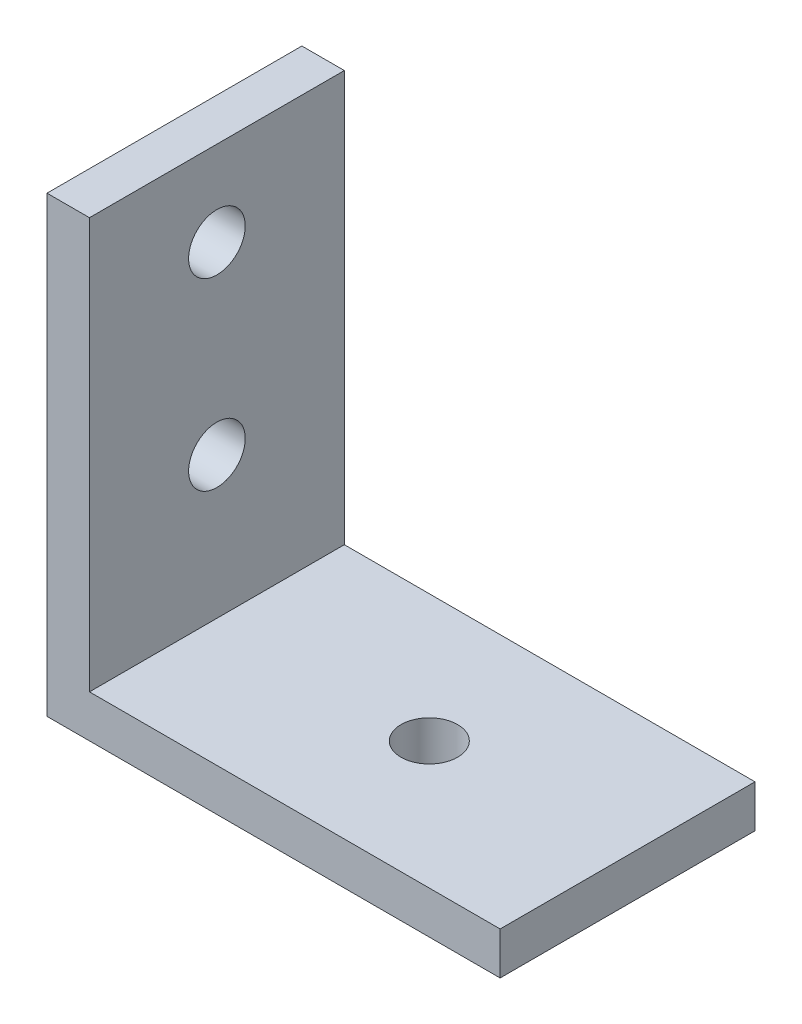
ISO-10303-21;
HEADER;
FILE_DESCRIPTION(('STEP AP214'),'2;1');
FILE_NAME('part.step','',(''),(''),'','','');
FILE_SCHEMA(('AUTOMOTIVE_DESIGN { 1 0 10303 214 1 1 1 1 }'));
ENDSEC;
DATA;
#1=APPLICATION_CONTEXT('core data for automotive mechanical design processes');
#2=APPLICATION_PROTOCOL_DEFINITION('international standard','automotive_design',2000,#1);
#3=PRODUCT_CONTEXT('',#1,'mechanical');
#4=PRODUCT('Part','Part','',(#3));
#5=PRODUCT_RELATED_PRODUCT_CATEGORY('part','',(#4));
#6=PRODUCT_DEFINITION_FORMATION('','',#4);
#7=PRODUCT_DEFINITION_CONTEXT('part definition',#1,'design');
#8=PRODUCT_DEFINITION('design','',#6,#7);
#9=PRODUCT_DEFINITION_SHAPE('','',#8);
#10=(LENGTH_UNIT() NAMED_UNIT(*) SI_UNIT(.MILLI.,.METRE.));
#11=(NAMED_UNIT(*) PLANE_ANGLE_UNIT() SI_UNIT($,.RADIAN.));
#12=(NAMED_UNIT(*) SI_UNIT($,.STERADIAN.) SOLID_ANGLE_UNIT());
#13=UNCERTAINTY_MEASURE_WITH_UNIT(LENGTH_MEASURE(1.E-05),#10,'distance_accuracy_value','');
#14=(GEOMETRIC_REPRESENTATION_CONTEXT(3) GLOBAL_UNCERTAINTY_ASSIGNED_CONTEXT((#13)) GLOBAL_UNIT_ASSIGNED_CONTEXT((#10,
#11,#12)) REPRESENTATION_CONTEXT('',''));
#15=CARTESIAN_POINT('',(0.,0.,0.));
#16=DIRECTION('',(0.,0.,1.));
#17=DIRECTION('',(1.,0.,0.));
#18=AXIS2_PLACEMENT_3D('',#15,#16,#17);
#19=CARTESIAN_POINT('',(0.,3.,0.));
#20=DIRECTION('',(0.,-1.,0.));
#21=DIRECTION('',(0.,0.,-1.));
#22=AXIS2_PLACEMENT_3D('',#19,#20,#21);
#23=PLANE('',#22);
#24=CARTESIAN_POINT('',(18.,3.,-9.));
#25=DIRECTION('',(0.,1.,0.));
#26=DIRECTION('',(0.,0.,1.));
#27=AXIS2_PLACEMENT_3D('',#24,#25,#26);
#28=CIRCLE('',#27,2.);
#29=CARTESIAN_POINT('',(18.,3.,-7.));
#30=VERTEX_POINT('',#29);
#31=EDGE_CURVE('E235',#30,#30,#28,.T.);
#32=ORIENTED_EDGE('',*,*,#31,.F.);
#33=EDGE_LOOP('',(#32));
#34=FACE_BOUND('',#33,.T.);
#35=DIRECTION('',(0.,0.,-1.));
#36=VECTOR('',#35,1.);
#37=CARTESIAN_POINT('',(3.,3.,0.));
#38=LINE('',#37,#36);
#39=CARTESIAN_POINT('',(3.,3.,0.));
#40=VERTEX_POINT('',#39);
#41=CARTESIAN_POINT('',(3.,3.,-18.));
#42=VERTEX_POINT('',#41);
#43=EDGE_CURVE('E57',#40,#42,#38,.T.);
#44=ORIENTED_EDGE('',*,*,#43,.F.);
#45=DIRECTION('',(1.,0.,0.));
#46=VECTOR('',#45,1.);
#47=CARTESIAN_POINT('',(0.,3.,0.));
#48=LINE('',#47,#46);
#49=CARTESIAN_POINT('',(32.,3.,0.));
#50=VERTEX_POINT('',#49);
#51=EDGE_CURVE('E91',#40,#50,#48,.T.);
#52=ORIENTED_EDGE('',*,*,#51,.T.);
#53=DIRECTION('',(0.,0.,-1.));
#54=VECTOR('',#53,1.);
#55=CARTESIAN_POINT('',(32.,3.,0.));
#56=LINE('',#55,#54);
#57=CARTESIAN_POINT('',(32.,3.,-18.));
#58=VERTEX_POINT('',#57);
#59=EDGE_CURVE('E62',#50,#58,#56,.T.);
#60=ORIENTED_EDGE('',*,*,#59,.T.);
#61=DIRECTION('',(-1.,0.,0.));
#62=VECTOR('',#61,1.);
#63=CARTESIAN_POINT('',(0.,3.,-18.));
#64=LINE('',#63,#62);
#65=EDGE_CURVE('E103',#58,#42,#64,.T.);
#66=ORIENTED_EDGE('',*,*,#65,.T.);
#67=EDGE_LOOP('',(#44,#52,#60,#66));
#68=FACE_BOUND('',#67,.T.);
#69=ADVANCED_FACE('F41',(#34,#68),#23,.F.);
#70=CARTESIAN_POINT('',(0.,3.,0.));
#71=DIRECTION('',(1.,0.,0.));
#72=DIRECTION('',(0.,0.,-1.));
#73=AXIS2_PLACEMENT_3D('',#70,#71,#72);
#74=PLANE('',#73);
#75=CARTESIAN_POINT('',(0.,26.,-9.));
#76=DIRECTION('',(1.,0.,0.));
#77=DIRECTION('',(0.,0.,-1.));
#78=AXIS2_PLACEMENT_3D('',#75,#76,#77);
#79=CIRCLE('',#78,2.);
#80=CARTESIAN_POINT('',(0.,26.,-11.));
#81=VERTEX_POINT('',#80);
#82=EDGE_CURVE('E229',#81,#81,#79,.T.);
#83=ORIENTED_EDGE('',*,*,#82,.T.);
#84=EDGE_LOOP('',(#83));
#85=FACE_BOUND('',#84,.T.);
#86=CARTESIAN_POINT('',(0.,13.,-9.));
#87=DIRECTION('',(1.,0.,0.));
#88=DIRECTION('',(0.,0.,-1.));
#89=AXIS2_PLACEMENT_3D('',#86,#87,#88);
#90=CIRCLE('',#89,2.);
#91=CARTESIAN_POINT('',(0.,13.,-11.));
#92=VERTEX_POINT('',#91);
#93=EDGE_CURVE('E236',#92,#92,#90,.T.);
#94=ORIENTED_EDGE('',*,*,#93,.T.);
#95=EDGE_LOOP('',(#94));
#96=FACE_BOUND('',#95,.T.);
#97=DIRECTION('',(0.,0.,1.));
#98=VECTOR('',#97,1.);
#99=CARTESIAN_POINT('',(0.,0.,0.));
#100=LINE('',#99,#98);
#101=CARTESIAN_POINT('',(0.,0.,-18.));
#102=VERTEX_POINT('',#101);
#103=CARTESIAN_POINT('',(0.,0.,0.));
#104=VERTEX_POINT('',#103);
#105=EDGE_CURVE('E99',#102,#104,#100,.T.);
#106=ORIENTED_EDGE('',*,*,#105,.T.);
#107=DIRECTION('',(0.,-1.,0.));
#108=VECTOR('',#107,1.);
#109=CARTESIAN_POINT('',(0.,3.,0.));
#110=LINE('',#109,#108);
#111=CARTESIAN_POINT('',(0.,32.,0.));
#112=VERTEX_POINT('',#111);
#113=EDGE_CURVE('E11',#112,#104,#110,.T.);
#114=ORIENTED_EDGE('',*,*,#113,.F.);
#115=DIRECTION('',(0.,0.,1.));
#116=VECTOR('',#115,1.);
#117=CARTESIAN_POINT('',(0.,32.,0.));
#118=LINE('',#117,#116);
#119=CARTESIAN_POINT('',(0.,32.,-18.));
#120=VERTEX_POINT('',#119);
#121=EDGE_CURVE('E105',#120,#112,#118,.T.);
#122=ORIENTED_EDGE('',*,*,#121,.F.);
#123=DIRECTION('',(0.,-1.,0.));
#124=VECTOR('',#123,1.);
#125=CARTESIAN_POINT('',(0.,3.,-18.));
#126=LINE('',#125,#124);
#127=EDGE_CURVE('E88',#120,#102,#126,.T.);
#128=ORIENTED_EDGE('',*,*,#127,.T.);
#129=EDGE_LOOP('',(#106,#114,#122,#128));
#130=FACE_BOUND('',#129,.T.);
#131=ADVANCED_FACE('F43',(#85,#96,#130),#74,.F.);
#132=CARTESIAN_POINT('',(0.,3.,0.));
#133=DIRECTION('',(0.,0.,-1.));
#134=DIRECTION('',(-1.,0.,0.));
#135=AXIS2_PLACEMENT_3D('',#132,#133,#134);
#136=PLANE('',#135);
#137=DIRECTION('',(1.,0.,0.));
#138=VECTOR('',#137,1.);
#139=CARTESIAN_POINT('',(0.,0.,0.));
#140=LINE('',#139,#138);
#141=CARTESIAN_POINT('',(32.,0.,0.));
#142=VERTEX_POINT('',#141);
#143=EDGE_CURVE('E106',#104,#142,#140,.T.);
#144=ORIENTED_EDGE('',*,*,#143,.T.);
#145=DIRECTION('',(0.,-1.,0.));
#146=VECTOR('',#145,1.);
#147=CARTESIAN_POINT('',(32.,3.,0.));
#148=LINE('',#147,#146);
#149=EDGE_CURVE('E47',#50,#142,#148,.T.);
#150=ORIENTED_EDGE('',*,*,#149,.F.);
#151=ORIENTED_EDGE('',*,*,#51,.F.);
#152=DIRECTION('',(0.,-1.,0.));
#153=VECTOR('',#152,1.);
#154=CARTESIAN_POINT('',(3.,32.,0.));
#155=LINE('',#154,#153);
#156=CARTESIAN_POINT('',(3.,32.,0.));
#157=VERTEX_POINT('',#156);
#158=EDGE_CURVE('E110',#157,#40,#155,.T.);
#159=ORIENTED_EDGE('',*,*,#158,.F.);
#160=DIRECTION('',(1.,0.,0.));
#161=VECTOR('',#160,1.);
#162=CARTESIAN_POINT('',(0.,32.,0.));
#163=LINE('',#162,#161);
#164=EDGE_CURVE('E130',#112,#157,#163,.T.);
#165=ORIENTED_EDGE('',*,*,#164,.F.);
#166=ORIENTED_EDGE('',*,*,#113,.T.);
#167=EDGE_LOOP('',(#144,#150,#151,#159,#165,#166));
#168=FACE_BOUND('',#167,.T.);
#169=ADVANCED_FACE('F122',(#168),#136,.F.);
#170=CARTESIAN_POINT('',(32.,3.,0.));
#171=DIRECTION('',(-1.,0.,0.));
#172=DIRECTION('',(0.,0.,1.));
#173=AXIS2_PLACEMENT_3D('',#170,#171,#172);
#174=PLANE('',#173);
#175=DIRECTION('',(0.,0.,-1.));
#176=VECTOR('',#175,1.);
#177=CARTESIAN_POINT('',(32.,0.,0.));
#178=LINE('',#177,#176);
#179=CARTESIAN_POINT('',(32.,0.,-18.));
#180=VERTEX_POINT('',#179);
#181=EDGE_CURVE('E94',#142,#180,#178,.T.);
#182=ORIENTED_EDGE('',*,*,#181,.T.);
#183=DIRECTION('',(0.,-1.,0.));
#184=VECTOR('',#183,1.);
#185=CARTESIAN_POINT('',(32.,3.,-18.));
#186=LINE('',#185,#184);
#187=EDGE_CURVE('E90',#58,#180,#186,.T.);
#188=ORIENTED_EDGE('',*,*,#187,.F.);
#189=ORIENTED_EDGE('',*,*,#59,.F.);
#190=ORIENTED_EDGE('',*,*,#149,.T.);
#191=EDGE_LOOP('',(#182,#188,#189,#190));
#192=FACE_BOUND('',#191,.T.);
#193=ADVANCED_FACE('F120',(#192),#174,.F.);
#194=CARTESIAN_POINT('',(0.,3.,-18.));
#195=DIRECTION('',(0.,0.,1.));
#196=DIRECTION('',(1.,0.,0.));
#197=AXIS2_PLACEMENT_3D('',#194,#195,#196);
#198=PLANE('',#197);
#199=DIRECTION('',(-1.,0.,0.));
#200=VECTOR('',#199,1.);
#201=CARTESIAN_POINT('',(0.,0.,-18.));
#202=LINE('',#201,#200);
#203=EDGE_CURVE('E84',#180,#102,#202,.T.);
#204=ORIENTED_EDGE('',*,*,#203,.T.);
#205=ORIENTED_EDGE('',*,*,#127,.F.);
#206=DIRECTION('',(-1.,0.,0.));
#207=VECTOR('',#206,1.);
#208=CARTESIAN_POINT('',(0.,32.,-18.));
#209=LINE('',#208,#207);
#210=CARTESIAN_POINT('',(3.,32.,-18.));
#211=VERTEX_POINT('',#210);
#212=EDGE_CURVE('E143',#211,#120,#209,.T.);
#213=ORIENTED_EDGE('',*,*,#212,.F.);
#214=DIRECTION('',(0.,-1.,0.));
#215=VECTOR('',#214,1.);
#216=CARTESIAN_POINT('',(3.,32.,-18.));
#217=LINE('',#216,#215);
#218=EDGE_CURVE('E112',#211,#42,#217,.T.);
#219=ORIENTED_EDGE('',*,*,#218,.T.);
#220=ORIENTED_EDGE('',*,*,#65,.F.);
#221=ORIENTED_EDGE('',*,*,#187,.T.);
#222=EDGE_LOOP('',(#204,#205,#213,#219,#220,#221));
#223=FACE_BOUND('',#222,.T.);
#224=ADVANCED_FACE('F85',(#223),#198,.F.);
#225=CARTESIAN_POINT('',(0.,0.,0.));
#226=DIRECTION('',(0.,-1.,0.));
#227=DIRECTION('',(0.,0.,-1.));
#228=AXIS2_PLACEMENT_3D('',#225,#226,#227);
#229=PLANE('',#228);
#230=CARTESIAN_POINT('',(18.,0.,-9.));
#231=DIRECTION('',(0.,1.,0.));
#232=DIRECTION('',(0.,0.,1.));
#233=AXIS2_PLACEMENT_3D('',#230,#231,#232);
#234=CIRCLE('',#233,2.);
#235=CARTESIAN_POINT('',(18.,0.,-7.));
#236=VERTEX_POINT('',#235);
#237=EDGE_CURVE('E147',#236,#236,#234,.T.);
#238=ORIENTED_EDGE('',*,*,#237,.T.);
#239=EDGE_LOOP('',(#238));
#240=FACE_BOUND('',#239,.T.);
#241=ORIENTED_EDGE('',*,*,#105,.F.);
#242=ORIENTED_EDGE('',*,*,#203,.F.);
#243=ORIENTED_EDGE('',*,*,#181,.F.);
#244=ORIENTED_EDGE('',*,*,#143,.F.);
#245=EDGE_LOOP('',(#241,#242,#243,#244));
#246=FACE_BOUND('',#245,.T.);
#247=ADVANCED_FACE('F104',(#240,#246),#229,.T.);
#248=CARTESIAN_POINT('',(3.,32.,0.));
#249=DIRECTION('',(-1.,0.,0.));
#250=DIRECTION('',(0.,0.,1.));
#251=AXIS2_PLACEMENT_3D('',#248,#249,#250);
#252=PLANE('',#251);
#253=CARTESIAN_POINT('',(3.,26.,-9.));
#254=DIRECTION('',(1.,0.,0.));
#255=DIRECTION('',(0.,0.,-1.));
#256=AXIS2_PLACEMENT_3D('',#253,#254,#255);
#257=CIRCLE('',#256,2.);
#258=CARTESIAN_POINT('',(3.,26.,-11.));
#259=VERTEX_POINT('',#258);
#260=EDGE_CURVE('E231',#259,#259,#257,.T.);
#261=ORIENTED_EDGE('',*,*,#260,.F.);
#262=EDGE_LOOP('',(#261));
#263=FACE_BOUND('',#262,.T.);
#264=CARTESIAN_POINT('',(3.,13.,-9.));
#265=DIRECTION('',(1.,0.,0.));
#266=DIRECTION('',(0.,0.,-1.));
#267=AXIS2_PLACEMENT_3D('',#264,#265,#266);
#268=CIRCLE('',#267,2.);
#269=CARTESIAN_POINT('',(3.,13.,-11.));
#270=VERTEX_POINT('',#269);
#271=EDGE_CURVE('E234',#270,#270,#268,.T.);
#272=ORIENTED_EDGE('',*,*,#271,.F.);
#273=EDGE_LOOP('',(#272));
#274=FACE_BOUND('',#273,.T.);
#275=ORIENTED_EDGE('',*,*,#43,.T.);
#276=ORIENTED_EDGE('',*,*,#218,.F.);
#277=DIRECTION('',(0.,0.,-1.));
#278=VECTOR('',#277,1.);
#279=CARTESIAN_POINT('',(3.,32.,0.));
#280=LINE('',#279,#278);
#281=EDGE_CURVE('E137',#157,#211,#280,.T.);
#282=ORIENTED_EDGE('',*,*,#281,.F.);
#283=ORIENTED_EDGE('',*,*,#158,.T.);
#284=EDGE_LOOP('',(#275,#276,#282,#283));
#285=FACE_BOUND('',#284,.T.);
#286=ADVANCED_FACE('F144',(#263,#274,#285),#252,.F.);
#287=CARTESIAN_POINT('',(0.,32.,0.));
#288=DIRECTION('',(0.,-1.,0.));
#289=DIRECTION('',(0.,0.,-1.));
#290=AXIS2_PLACEMENT_3D('',#287,#288,#289);
#291=PLANE('',#290);
#292=ORIENTED_EDGE('',*,*,#121,.T.);
#293=ORIENTED_EDGE('',*,*,#164,.T.);
#294=ORIENTED_EDGE('',*,*,#281,.T.);
#295=ORIENTED_EDGE('',*,*,#212,.T.);
#296=EDGE_LOOP('',(#292,#293,#294,#295));
#297=FACE_BOUND('',#296,.T.);
#298=ADVANCED_FACE('F136',(#297),#291,.F.);
#299=CARTESIAN_POINT('',(18.,0.,-9.));
#300=DIRECTION('',(0.,1.,0.));
#301=DIRECTION('',(0.,0.,1.));
#302=AXIS2_PLACEMENT_3D('',#299,#300,#301);
#303=CYLINDRICAL_SURFACE('',#302,2.);
#304=ORIENTED_EDGE('',*,*,#237,.F.);
#305=EDGE_LOOP('',(#304));
#306=FACE_BOUND('',#305,.T.);
#307=ORIENTED_EDGE('',*,*,#31,.T.);
#308=EDGE_LOOP('',(#307));
#309=FACE_BOUND('',#308,.T.);
#310=ADVANCED_FACE('F187',(#306,#309),#303,.F.);
#311=CARTESIAN_POINT('',(0.,13.,-9.));
#312=DIRECTION('',(1.,0.,0.));
#313=DIRECTION('',(0.,0.,-1.));
#314=AXIS2_PLACEMENT_3D('',#311,#312,#313);
#315=CYLINDRICAL_SURFACE('',#314,2.);
#316=ORIENTED_EDGE('',*,*,#93,.F.);
#317=EDGE_LOOP('',(#316));
#318=FACE_BOUND('',#317,.T.);
#319=ORIENTED_EDGE('',*,*,#271,.T.);
#320=EDGE_LOOP('',(#319));
#321=FACE_BOUND('',#320,.T.);
#322=ADVANCED_FACE('F205',(#318,#321),#315,.F.);
#323=CARTESIAN_POINT('',(0.,26.,-9.));
#324=DIRECTION('',(1.,0.,0.));
#325=DIRECTION('',(0.,0.,-1.));
#326=AXIS2_PLACEMENT_3D('',#323,#324,#325);
#327=CYLINDRICAL_SURFACE('',#326,2.);
#328=ORIENTED_EDGE('',*,*,#82,.F.);
#329=EDGE_LOOP('',(#328));
#330=FACE_BOUND('',#329,.T.);
#331=ORIENTED_EDGE('',*,*,#260,.T.);
#332=EDGE_LOOP('',(#331));
#333=FACE_BOUND('',#332,.T.);
#334=ADVANCED_FACE('F215',(#330,#333),#327,.F.);
#335=CLOSED_SHELL('',(#69,#131,#169,#193,#224,#247,#286,#298,#310,#322,#334));
#336=MANIFOLD_SOLID_BREP('B2',#335);
#337=ADVANCED_BREP_SHAPE_REPRESENTATION('',(#18,#336),#14);
#338=SHAPE_DEFINITION_REPRESENTATION(#9,#337);
ENDSEC;
END-ISO-10303-21;
